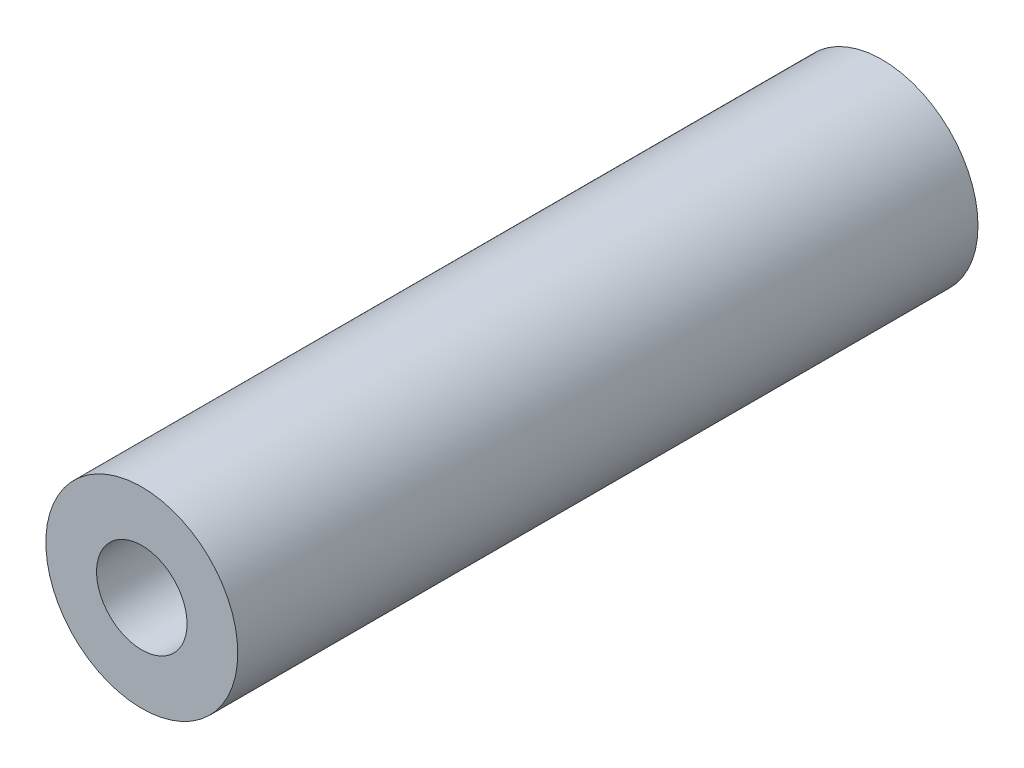
ISO-10303-21;
HEADER;
FILE_DESCRIPTION(('STEP AP214'),'2;1');
FILE_NAME('part.step','',(''),(''),'','','');
FILE_SCHEMA(('AUTOMOTIVE_DESIGN { 1 0 10303 214 1 1 1 1 }'));
ENDSEC;
DATA;
#1=APPLICATION_CONTEXT('core data for automotive mechanical design processes');
#2=APPLICATION_PROTOCOL_DEFINITION('international standard','automotive_design',2000,#1);
#3=PRODUCT_CONTEXT('',#1,'mechanical');
#4=PRODUCT('Part','Part','',(#3));
#5=PRODUCT_RELATED_PRODUCT_CATEGORY('part','',(#4));
#6=PRODUCT_DEFINITION_FORMATION('','',#4);
#7=PRODUCT_DEFINITION_CONTEXT('part definition',#1,'design');
#8=PRODUCT_DEFINITION('design','',#6,#7);
#9=PRODUCT_DEFINITION_SHAPE('','',#8);
#10=(LENGTH_UNIT() NAMED_UNIT(*) SI_UNIT(.MILLI.,.METRE.));
#11=(NAMED_UNIT(*) PLANE_ANGLE_UNIT() SI_UNIT($,.RADIAN.));
#12=(NAMED_UNIT(*) SI_UNIT($,.STERADIAN.) SOLID_ANGLE_UNIT());
#13=UNCERTAINTY_MEASURE_WITH_UNIT(LENGTH_MEASURE(1.E-05),#10,'distance_accuracy_value','');
#14=(GEOMETRIC_REPRESENTATION_CONTEXT(3) GLOBAL_UNCERTAINTY_ASSIGNED_CONTEXT((#13)) GLOBAL_UNIT_ASSIGNED_CONTEXT((#10,
#11,#12)) REPRESENTATION_CONTEXT('',''));
#15=CARTESIAN_POINT('',(0.,0.,0.));
#16=DIRECTION('',(0.,0.,1.));
#17=DIRECTION('',(1.,0.,0.));
#18=AXIS2_PLACEMENT_3D('',#15,#16,#17);
#19=CARTESIAN_POINT('',(0.,0.,27.));
#20=DIRECTION('',(0.,0.,1.));
#21=DIRECTION('',(1.,0.,0.));
#22=AXIS2_PLACEMENT_3D('',#19,#20,#21);
#23=PLANE('',#22);
#24=CARTESIAN_POINT('',(0.,0.,27.));
#25=DIRECTION('',(0.,0.,1.));
#26=DIRECTION('',(1.,0.,0.));
#27=AXIS2_PLACEMENT_3D('',#24,#25,#26);
#28=CIRCLE('',#27,3.5);
#29=CARTESIAN_POINT('',(3.5,0.,27.));
#30=VERTEX_POINT('',#29);
#31=EDGE_CURVE('E10',#30,#30,#28,.T.);
#32=ORIENTED_EDGE('',*,*,#31,.T.);
#33=EDGE_LOOP('',(#32));
#34=FACE_BOUND('',#33,.T.);
#35=CARTESIAN_POINT('',(0.,0.,27.));
#36=DIRECTION('',(0.,0.,1.));
#37=DIRECTION('',(1.,0.,0.));
#38=AXIS2_PLACEMENT_3D('',#35,#36,#37);
#39=CIRCLE('',#38,1.65);
#40=CARTESIAN_POINT('',(1.65,0.,27.));
#41=VERTEX_POINT('',#40);
#42=EDGE_CURVE('E43',#41,#41,#39,.T.);
#43=ORIENTED_EDGE('',*,*,#42,.F.);
#44=EDGE_LOOP('',(#43));
#45=FACE_BOUND('',#44,.T.);
#46=ADVANCED_FACE('F32',(#34,#45),#23,.T.);
#47=CARTESIAN_POINT('',(0.,0.,0.));
#48=DIRECTION('',(0.,0.,1.));
#49=DIRECTION('',(1.,0.,0.));
#50=AXIS2_PLACEMENT_3D('',#47,#48,#49);
#51=PLANE('',#50);
#52=CARTESIAN_POINT('',(0.,0.,0.));
#53=DIRECTION('',(0.,0.,1.));
#54=DIRECTION('',(1.,0.,0.));
#55=AXIS2_PLACEMENT_3D('',#52,#53,#54);
#56=CIRCLE('',#55,3.5);
#57=CARTESIAN_POINT('',(3.5,0.,0.));
#58=VERTEX_POINT('',#57);
#59=EDGE_CURVE('E36',#58,#58,#56,.T.);
#60=ORIENTED_EDGE('',*,*,#59,.F.);
#61=EDGE_LOOP('',(#60));
#62=FACE_BOUND('',#61,.T.);
#63=CARTESIAN_POINT('',(0.,0.,0.));
#64=DIRECTION('',(0.,0.,1.));
#65=DIRECTION('',(1.,0.,0.));
#66=AXIS2_PLACEMENT_3D('',#63,#64,#65);
#67=CIRCLE('',#66,1.65);
#68=CARTESIAN_POINT('',(1.65,0.,0.));
#69=VERTEX_POINT('',#68);
#70=EDGE_CURVE('E45',#69,#69,#67,.T.);
#71=ORIENTED_EDGE('',*,*,#70,.T.);
#72=EDGE_LOOP('',(#71));
#73=FACE_BOUND('',#72,.T.);
#74=ADVANCED_FACE('F55',(#62,#73),#51,.F.);
#75=CARTESIAN_POINT('',(0.,0.,27.));
#76=DIRECTION('',(0.,0.,-1.));
#77=DIRECTION('',(-1.,0.,0.));
#78=AXIS2_PLACEMENT_3D('',#75,#76,#77);
#79=CYLINDRICAL_SURFACE('',#78,3.5);
#80=ORIENTED_EDGE('',*,*,#31,.F.);
#81=EDGE_LOOP('',(#80));
#82=FACE_BOUND('',#81,.T.);
#83=ORIENTED_EDGE('',*,*,#59,.T.);
#84=EDGE_LOOP('',(#83));
#85=FACE_BOUND('',#84,.T.);
#86=ADVANCED_FACE('F34',(#82,#85),#79,.T.);
#87=CARTESIAN_POINT('',(0.,0.,27.));
#88=DIRECTION('',(0.,0.,-1.));
#89=DIRECTION('',(-1.,0.,0.));
#90=AXIS2_PLACEMENT_3D('',#87,#88,#89);
#91=CYLINDRICAL_SURFACE('',#90,1.65);
#92=ORIENTED_EDGE('',*,*,#42,.T.);
#93=EDGE_LOOP('',(#92));
#94=FACE_BOUND('',#93,.T.);
#95=ORIENTED_EDGE('',*,*,#70,.F.);
#96=EDGE_LOOP('',(#95));
#97=FACE_BOUND('',#96,.T.);
#98=ADVANCED_FACE('F51',(#94,#97),#91,.F.);
#99=CLOSED_SHELL('',(#46,#74,#86,#98));
#100=MANIFOLD_SOLID_BREP('B2',#99);
#101=ADVANCED_BREP_SHAPE_REPRESENTATION('',(#18,#100),#14);
#102=SHAPE_DEFINITION_REPRESENTATION(#9,#101);
ENDSEC;
END-ISO-10303-21;
